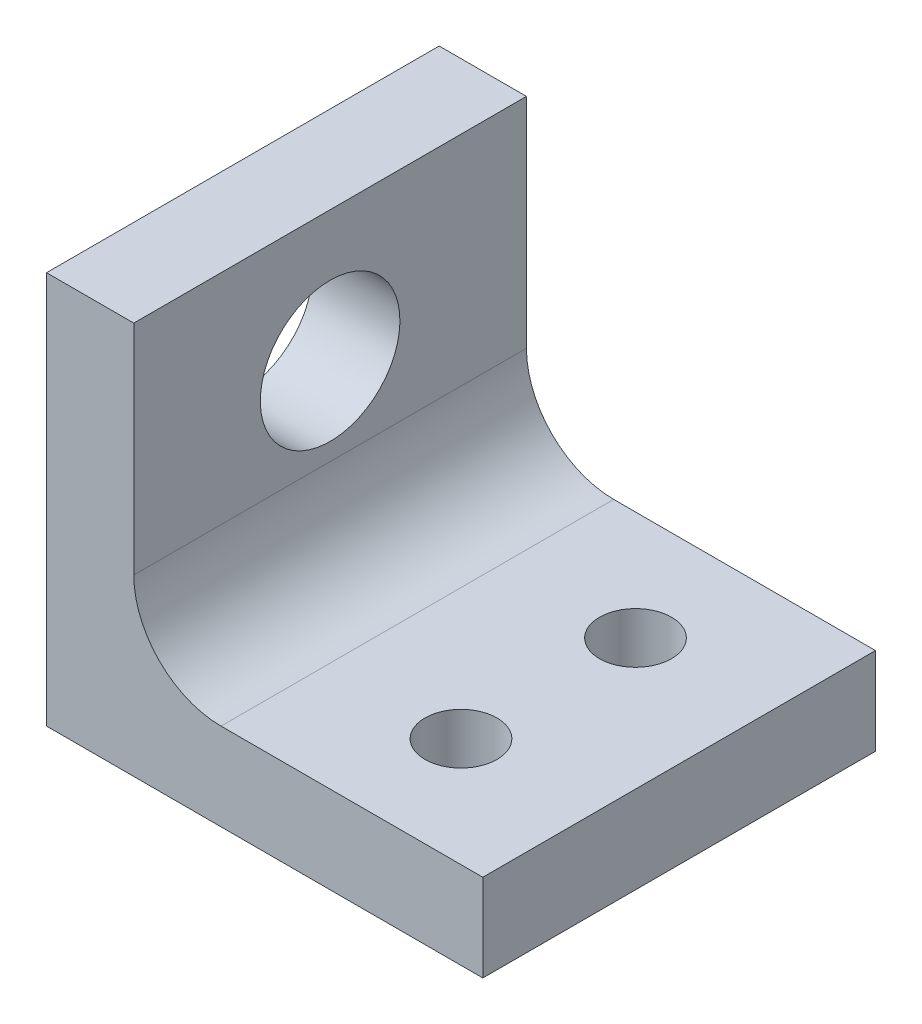
ISO-10303-21;
HEADER;
FILE_DESCRIPTION(('STEP AP214'),'2;1');
FILE_NAME('part.step','',(''),(''),'','','');
FILE_SCHEMA(('AUTOMOTIVE_DESIGN { 1 0 10303 214 1 1 1 1 }'));
ENDSEC;
DATA;
#1=APPLICATION_CONTEXT('core data for automotive mechanical design processes');
#2=APPLICATION_PROTOCOL_DEFINITION('international standard','automotive_design',2000,#1);
#3=PRODUCT_CONTEXT('',#1,'mechanical');
#4=PRODUCT('Part','Part','',(#3));
#5=PRODUCT_RELATED_PRODUCT_CATEGORY('part','',(#4));
#6=PRODUCT_DEFINITION_FORMATION('','',#4);
#7=PRODUCT_DEFINITION_CONTEXT('part definition',#1,'design');
#8=PRODUCT_DEFINITION('design','',#6,#7);
#9=PRODUCT_DEFINITION_SHAPE('','',#8);
#10=(LENGTH_UNIT() NAMED_UNIT(*) SI_UNIT(.MILLI.,.METRE.));
#11=(NAMED_UNIT(*) PLANE_ANGLE_UNIT() SI_UNIT($,.RADIAN.));
#12=(NAMED_UNIT(*) SI_UNIT($,.STERADIAN.) SOLID_ANGLE_UNIT());
#13=UNCERTAINTY_MEASURE_WITH_UNIT(LENGTH_MEASURE(1.E-05),#10,'distance_accuracy_value','');
#14=(GEOMETRIC_REPRESENTATION_CONTEXT(3) GLOBAL_UNCERTAINTY_ASSIGNED_CONTEXT((#13)) GLOBAL_UNIT_ASSIGNED_CONTEXT((#10,
#11,#12)) REPRESENTATION_CONTEXT('',''));
#15=CARTESIAN_POINT('',(0.,0.,0.));
#16=DIRECTION('',(0.,0.,1.));
#17=DIRECTION('',(1.,0.,0.));
#18=AXIS2_PLACEMENT_3D('',#15,#16,#17);
#19=CARTESIAN_POINT('',(20.,0.,18.));
#20=DIRECTION('',(0.,1.,0.));
#21=DIRECTION('',(-1.,0.,0.));
#22=AXIS2_PLACEMENT_3D('',#19,#20,#21);
#23=PLANE('',#22);
#24=CARTESIAN_POINT('',(14.,0.,5.));
#25=DIRECTION('',(0.,1.,0.));
#26=DIRECTION('',(-1.,0.,0.));
#27=AXIS2_PLACEMENT_3D('',#24,#25,#26);
#28=CIRCLE('',#27,1.65);
#29=CARTESIAN_POINT('',(12.35,0.,5.));
#30=VERTEX_POINT('',#29);
#31=EDGE_CURVE('E139',#30,#30,#28,.T.);
#32=ORIENTED_EDGE('',*,*,#31,.T.);
#33=EDGE_LOOP('',(#32));
#34=FACE_BOUND('',#33,.T.);
#35=CARTESIAN_POINT('',(14.,0.,13.));
#36=DIRECTION('',(0.,1.,0.));
#37=DIRECTION('',(-1.,0.,0.));
#38=AXIS2_PLACEMENT_3D('',#35,#36,#37);
#39=CIRCLE('',#38,1.65);
#40=CARTESIAN_POINT('',(12.35,0.,13.));
#41=VERTEX_POINT('',#40);
#42=EDGE_CURVE('E141',#41,#41,#39,.T.);
#43=ORIENTED_EDGE('',*,*,#42,.T.);
#44=EDGE_LOOP('',(#43));
#45=FACE_BOUND('',#44,.T.);
#46=DIRECTION('',(1.,0.,0.));
#47=VECTOR('',#46,1.);
#48=CARTESIAN_POINT('',(20.,0.,0.));
#49=LINE('',#48,#47);
#50=CARTESIAN_POINT('',(0.,0.,0.));
#51=VERTEX_POINT('',#50);
#52=CARTESIAN_POINT('',(20.,0.,0.));
#53=VERTEX_POINT('',#52);
#54=EDGE_CURVE('E119',#51,#53,#49,.T.);
#55=ORIENTED_EDGE('',*,*,#54,.T.);
#56=DIRECTION('',(0.,0.,-1.));
#57=VECTOR('',#56,1.);
#58=CARTESIAN_POINT('',(20.,0.,18.));
#59=LINE('',#58,#57);
#60=CARTESIAN_POINT('',(20.,0.,18.));
#61=VERTEX_POINT('',#60);
#62=EDGE_CURVE('E105',#61,#53,#59,.T.);
#63=ORIENTED_EDGE('',*,*,#62,.F.);
#64=DIRECTION('',(1.,0.,0.));
#65=VECTOR('',#64,1.);
#66=CARTESIAN_POINT('',(20.,0.,18.));
#67=LINE('',#66,#65);
#68=CARTESIAN_POINT('',(0.,0.,18.));
#69=VERTEX_POINT('',#68);
#70=EDGE_CURVE('E108',#69,#61,#67,.T.);
#71=ORIENTED_EDGE('',*,*,#70,.F.);
#72=DIRECTION('',(0.,0.,-1.));
#73=VECTOR('',#72,1.);
#74=CARTESIAN_POINT('',(0.,0.,18.));
#75=LINE('',#74,#73);
#76=EDGE_CURVE('E154',#69,#51,#75,.T.);
#77=ORIENTED_EDGE('',*,*,#76,.T.);
#78=EDGE_LOOP('',(#55,#63,#71,#77));
#79=FACE_BOUND('',#78,.T.);
#80=ADVANCED_FACE('F39',(#34,#45,#79),#23,.F.);
#81=CARTESIAN_POINT('',(20.,4.,18.));
#82=DIRECTION('',(-1.,0.,0.));
#83=DIRECTION('',(0.,0.,1.));
#84=AXIS2_PLACEMENT_3D('',#81,#82,#83);
#85=PLANE('',#84);
#86=DIRECTION('',(0.,1.,0.));
#87=VECTOR('',#86,1.);
#88=CARTESIAN_POINT('',(20.,4.,0.));
#89=LINE('',#88,#87);
#90=CARTESIAN_POINT('',(20.,4.,0.));
#91=VERTEX_POINT('',#90);
#92=EDGE_CURVE('E131',#53,#91,#89,.T.);
#93=ORIENTED_EDGE('',*,*,#92,.T.);
#94=DIRECTION('',(0.,0.,-1.));
#95=VECTOR('',#94,1.);
#96=CARTESIAN_POINT('',(20.,4.,18.));
#97=LINE('',#96,#95);
#98=CARTESIAN_POINT('',(20.,4.,18.));
#99=VERTEX_POINT('',#98);
#100=EDGE_CURVE('E102',#99,#91,#97,.T.);
#101=ORIENTED_EDGE('',*,*,#100,.F.);
#102=DIRECTION('',(0.,1.,0.));
#103=VECTOR('',#102,1.);
#104=CARTESIAN_POINT('',(20.,4.,18.));
#105=LINE('',#104,#103);
#106=EDGE_CURVE('E96',#61,#99,#105,.T.);
#107=ORIENTED_EDGE('',*,*,#106,.F.);
#108=ORIENTED_EDGE('',*,*,#62,.T.);
#109=EDGE_LOOP('',(#93,#101,#107,#108));
#110=FACE_BOUND('',#109,.T.);
#111=ADVANCED_FACE('F99',(#110),#85,.F.);
#112=CARTESIAN_POINT('',(4.,4.,18.));
#113=DIRECTION('',(0.,-1.,0.));
#114=DIRECTION('',(1.,0.,0.));
#115=AXIS2_PLACEMENT_3D('',#112,#113,#114);
#116=PLANE('',#115);
#117=CARTESIAN_POINT('',(14.,4.,5.));
#118=DIRECTION('',(0.,1.,0.));
#119=DIRECTION('',(-1.,0.,0.));
#120=AXIS2_PLACEMENT_3D('',#117,#118,#119);
#121=CIRCLE('',#120,1.65);
#122=CARTESIAN_POINT('',(12.35,4.,5.));
#123=VERTEX_POINT('',#122);
#124=EDGE_CURVE('E229',#123,#123,#121,.T.);
#125=ORIENTED_EDGE('',*,*,#124,.F.);
#126=EDGE_LOOP('',(#125));
#127=FACE_BOUND('',#126,.T.);
#128=CARTESIAN_POINT('',(14.,4.,13.));
#129=DIRECTION('',(0.,1.,0.));
#130=DIRECTION('',(-1.,0.,0.));
#131=AXIS2_PLACEMENT_3D('',#128,#129,#130);
#132=CIRCLE('',#131,1.65);
#133=CARTESIAN_POINT('',(12.35,4.,13.));
#134=VERTEX_POINT('',#133);
#135=EDGE_CURVE('E235',#134,#134,#132,.T.);
#136=ORIENTED_EDGE('',*,*,#135,.F.);
#137=EDGE_LOOP('',(#136));
#138=FACE_BOUND('',#137,.T.);
#139=DIRECTION('',(-1.,0.,0.));
#140=VECTOR('',#139,1.);
#141=CARTESIAN_POINT('',(4.,4.,0.));
#142=LINE('',#141,#140);
#143=CARTESIAN_POINT('',(8.,4.,0.));
#144=VERTEX_POINT('',#143);
#145=EDGE_CURVE('E151',#91,#144,#142,.T.);
#146=ORIENTED_EDGE('',*,*,#145,.T.);
#147=DIRECTION('',(0.,0.,-1.));
#148=VECTOR('',#147,1.);
#149=CARTESIAN_POINT('',(8.,4.,18.));
#150=LINE('',#149,#148);
#151=CARTESIAN_POINT('',(8.,4.,18.));
#152=VERTEX_POINT('',#151);
#153=EDGE_CURVE('E53',#144,#152,#150,.F.);
#154=ORIENTED_EDGE('',*,*,#153,.T.);
#155=DIRECTION('',(-1.,0.,0.));
#156=VECTOR('',#155,1.);
#157=CARTESIAN_POINT('',(4.,4.,18.));
#158=LINE('',#157,#156);
#159=EDGE_CURVE('E110',#99,#152,#158,.T.);
#160=ORIENTED_EDGE('',*,*,#159,.F.);
#161=ORIENTED_EDGE('',*,*,#100,.T.);
#162=EDGE_LOOP('',(#146,#154,#160,#161));
#163=FACE_BOUND('',#162,.T.);
#164=ADVANCED_FACE('F198',(#127,#138,#163),#116,.F.);
#165=CARTESIAN_POINT('',(4.,18.,18.));
#166=DIRECTION('',(-1.,0.,0.));
#167=DIRECTION('',(0.,-1.,0.));
#168=AXIS2_PLACEMENT_3D('',#165,#166,#167);
#169=PLANE('',#168);
#170=CARTESIAN_POINT('',(4.,12.,9.));
#171=DIRECTION('',(1.,0.,0.));
#172=DIRECTION('',(0.,1.,0.));
#173=AXIS2_PLACEMENT_3D('',#170,#171,#172);
#174=CIRCLE('',#173,3.2);
#175=CARTESIAN_POINT('',(4.,15.2,9.));
#176=VERTEX_POINT('',#175);
#177=EDGE_CURVE('E133',#176,#176,#174,.T.);
#178=ORIENTED_EDGE('',*,*,#177,.F.);
#179=EDGE_LOOP('',(#178));
#180=FACE_BOUND('',#179,.T.);
#181=DIRECTION('',(0.,1.,0.));
#182=VECTOR('',#181,1.);
#183=CARTESIAN_POINT('',(4.,18.,18.));
#184=LINE('',#183,#182);
#185=CARTESIAN_POINT('',(4.,8.,18.));
#186=VERTEX_POINT('',#185);
#187=CARTESIAN_POINT('',(4.,18.,18.));
#188=VERTEX_POINT('',#187);
#189=EDGE_CURVE('E149',#186,#188,#184,.T.);
#190=ORIENTED_EDGE('',*,*,#189,.F.);
#191=DIRECTION('',(0.,0.,-1.));
#192=VECTOR('',#191,1.);
#193=CARTESIAN_POINT('',(4.,8.,0.));
#194=LINE('',#193,#192);
#195=CARTESIAN_POINT('',(4.,8.,0.));
#196=VERTEX_POINT('',#195);
#197=EDGE_CURVE('E122',#186,#196,#194,.T.);
#198=ORIENTED_EDGE('',*,*,#197,.T.);
#199=DIRECTION('',(0.,1.,0.));
#200=VECTOR('',#199,1.);
#201=CARTESIAN_POINT('',(4.,18.,0.));
#202=LINE('',#201,#200);
#203=CARTESIAN_POINT('',(4.,18.,0.));
#204=VERTEX_POINT('',#203);
#205=EDGE_CURVE('E160',#196,#204,#202,.T.);
#206=ORIENTED_EDGE('',*,*,#205,.T.);
#207=DIRECTION('',(0.,0.,-1.));
#208=VECTOR('',#207,1.);
#209=CARTESIAN_POINT('',(4.,18.,18.));
#210=LINE('',#209,#208);
#211=EDGE_CURVE('E123',#188,#204,#210,.T.);
#212=ORIENTED_EDGE('',*,*,#211,.F.);
#213=EDGE_LOOP('',(#190,#198,#206,#212));
#214=FACE_BOUND('',#213,.T.);
#215=ADVANCED_FACE('F187',(#180,#214),#169,.F.);
#216=CARTESIAN_POINT('',(0.,18.,18.));
#217=DIRECTION('',(0.,-1.,0.));
#218=DIRECTION('',(0.,0.,-1.));
#219=AXIS2_PLACEMENT_3D('',#216,#217,#218);
#220=PLANE('',#219);
#221=DIRECTION('',(-1.,0.,0.));
#222=VECTOR('',#221,1.);
#223=CARTESIAN_POINT('',(0.,18.,0.));
#224=LINE('',#223,#222);
#225=CARTESIAN_POINT('',(0.,18.,0.));
#226=VERTEX_POINT('',#225);
#227=EDGE_CURVE('E156',#204,#226,#224,.T.);
#228=ORIENTED_EDGE('',*,*,#227,.T.);
#229=DIRECTION('',(0.,0.,-1.));
#230=VECTOR('',#229,1.);
#231=CARTESIAN_POINT('',(0.,18.,18.));
#232=LINE('',#231,#230);
#233=CARTESIAN_POINT('',(0.,18.,18.));
#234=VERTEX_POINT('',#233);
#235=EDGE_CURVE('E161',#234,#226,#232,.T.);
#236=ORIENTED_EDGE('',*,*,#235,.F.);
#237=DIRECTION('',(-1.,0.,0.));
#238=VECTOR('',#237,1.);
#239=CARTESIAN_POINT('',(0.,18.,18.));
#240=LINE('',#239,#238);
#241=EDGE_CURVE('E148',#188,#234,#240,.T.);
#242=ORIENTED_EDGE('',*,*,#241,.F.);
#243=ORIENTED_EDGE('',*,*,#211,.T.);
#244=EDGE_LOOP('',(#228,#236,#242,#243));
#245=FACE_BOUND('',#244,.T.);
#246=ADVANCED_FACE('F167',(#245),#220,.F.);
#247=CARTESIAN_POINT('',(0.,0.,18.));
#248=DIRECTION('',(1.,0.,0.));
#249=DIRECTION('',(0.,0.,-1.));
#250=AXIS2_PLACEMENT_3D('',#247,#248,#249);
#251=PLANE('',#250);
#252=CARTESIAN_POINT('',(0.,12.,9.));
#253=DIRECTION('',(1.,0.,0.));
#254=DIRECTION('',(0.,0.,-1.));
#255=AXIS2_PLACEMENT_3D('',#252,#253,#254);
#256=CIRCLE('',#255,3.2);
#257=CARTESIAN_POINT('',(0.,12.,5.8));
#258=VERTEX_POINT('',#257);
#259=EDGE_CURVE('E126',#258,#258,#256,.T.);
#260=ORIENTED_EDGE('',*,*,#259,.T.);
#261=EDGE_LOOP('',(#260));
#262=FACE_BOUND('',#261,.T.);
#263=DIRECTION('',(0.,-1.,0.));
#264=VECTOR('',#263,1.);
#265=CARTESIAN_POINT('',(0.,0.,0.));
#266=LINE('',#265,#264);
#267=EDGE_CURVE('E120',#226,#51,#266,.T.);
#268=ORIENTED_EDGE('',*,*,#267,.T.);
#269=ORIENTED_EDGE('',*,*,#76,.F.);
#270=DIRECTION('',(0.,-1.,0.));
#271=VECTOR('',#270,1.);
#272=CARTESIAN_POINT('',(0.,0.,18.));
#273=LINE('',#272,#271);
#274=EDGE_CURVE('E113',#234,#69,#273,.T.);
#275=ORIENTED_EDGE('',*,*,#274,.F.);
#276=ORIENTED_EDGE('',*,*,#235,.T.);
#277=EDGE_LOOP('',(#268,#269,#275,#276));
#278=FACE_BOUND('',#277,.T.);
#279=ADVANCED_FACE('F180',(#262,#278),#251,.F.);
#280=CARTESIAN_POINT('',(0.,0.,18.));
#281=DIRECTION('',(0.,0.,-1.));
#282=DIRECTION('',(-1.,0.,0.));
#283=AXIS2_PLACEMENT_3D('',#280,#281,#282);
#284=PLANE('',#283);
#285=ORIENTED_EDGE('',*,*,#70,.T.);
#286=ORIENTED_EDGE('',*,*,#106,.T.);
#287=ORIENTED_EDGE('',*,*,#159,.T.);
#288=CARTESIAN_POINT('',(8.,8.,18.));
#289=DIRECTION('',(0.,0.,-1.));
#290=DIRECTION('',(-1.,0.,0.));
#291=AXIS2_PLACEMENT_3D('',#288,#289,#290);
#292=CIRCLE('',#291,4.);
#293=EDGE_CURVE('E11',#152,#186,#292,.T.);
#294=ORIENTED_EDGE('',*,*,#293,.T.);
#295=ORIENTED_EDGE('',*,*,#189,.T.);
#296=ORIENTED_EDGE('',*,*,#241,.T.);
#297=ORIENTED_EDGE('',*,*,#274,.T.);
#298=EDGE_LOOP('',(#285,#286,#287,#294,#295,#296,#297));
#299=FACE_BOUND('',#298,.T.);
#300=ADVANCED_FACE('F111',(#299),#284,.F.);
#301=CARTESIAN_POINT('',(0.,0.,0.));
#302=DIRECTION('',(0.,0.,-1.));
#303=DIRECTION('',(-1.,0.,0.));
#304=AXIS2_PLACEMENT_3D('',#301,#302,#303);
#305=PLANE('',#304);
#306=ORIENTED_EDGE('',*,*,#54,.F.);
#307=ORIENTED_EDGE('',*,*,#267,.F.);
#308=ORIENTED_EDGE('',*,*,#227,.F.);
#309=ORIENTED_EDGE('',*,*,#205,.F.);
#310=CARTESIAN_POINT('',(8.,8.,0.));
#311=DIRECTION('',(0.,0.,-1.));
#312=DIRECTION('',(-1.,0.,0.));
#313=AXIS2_PLACEMENT_3D('',#310,#311,#312);
#314=CIRCLE('',#313,4.);
#315=EDGE_CURVE('E50',#196,#144,#314,.F.);
#316=ORIENTED_EDGE('',*,*,#315,.T.);
#317=ORIENTED_EDGE('',*,*,#145,.F.);
#318=ORIENTED_EDGE('',*,*,#92,.F.);
#319=EDGE_LOOP('',(#306,#307,#308,#309,#316,#317,#318));
#320=FACE_BOUND('',#319,.T.);
#321=ADVANCED_FACE('F174',(#320),#305,.T.);
#322=CARTESIAN_POINT('',(-21.,12.,9.));
#323=DIRECTION('',(1.,0.,0.));
#324=DIRECTION('',(0.,1.,0.));
#325=AXIS2_PLACEMENT_3D('',#322,#323,#324);
#326=CYLINDRICAL_SURFACE('',#325,3.2);
#327=ORIENTED_EDGE('',*,*,#177,.T.);
#328=EDGE_LOOP('',(#327));
#329=FACE_BOUND('',#328,.T.);
#330=ORIENTED_EDGE('',*,*,#259,.F.);
#331=EDGE_LOOP('',(#330));
#332=FACE_BOUND('',#331,.T.);
#333=ADVANCED_FACE('F208',(#329,#332),#326,.F.);
#334=CARTESIAN_POINT('',(8.,8.,18.));
#335=DIRECTION('',(0.,0.,1.));
#336=DIRECTION('',(1.,0.,0.));
#337=AXIS2_PLACEMENT_3D('',#334,#335,#336);
#338=CYLINDRICAL_SURFACE('',#337,4.);
#339=ORIENTED_EDGE('',*,*,#293,.F.);
#340=ORIENTED_EDGE('',*,*,#153,.F.);
#341=ORIENTED_EDGE('',*,*,#315,.F.);
#342=ORIENTED_EDGE('',*,*,#197,.F.);
#343=EDGE_LOOP('',(#339,#340,#341,#342));
#344=FACE_BOUND('',#343,.T.);
#345=ADVANCED_FACE('F41',(#344),#338,.F.);
#346=CARTESIAN_POINT('',(14.,-21.,13.));
#347=DIRECTION('',(0.,1.,0.));
#348=DIRECTION('',(-1.,0.,0.));
#349=AXIS2_PLACEMENT_3D('',#346,#347,#348);
#350=CYLINDRICAL_SURFACE('',#349,1.65);
#351=ORIENTED_EDGE('',*,*,#135,.T.);
#352=EDGE_LOOP('',(#351));
#353=FACE_BOUND('',#352,.T.);
#354=ORIENTED_EDGE('',*,*,#42,.F.);
#355=EDGE_LOOP('',(#354));
#356=FACE_BOUND('',#355,.T.);
#357=ADVANCED_FACE('F209',(#353,#356),#350,.F.);
#358=CARTESIAN_POINT('',(14.,-21.,5.));
#359=DIRECTION('',(0.,1.,0.));
#360=DIRECTION('',(-1.,0.,0.));
#361=AXIS2_PLACEMENT_3D('',#358,#359,#360);
#362=CYLINDRICAL_SURFACE('',#361,1.65);
#363=ORIENTED_EDGE('',*,*,#124,.T.);
#364=EDGE_LOOP('',(#363));
#365=FACE_BOUND('',#364,.T.);
#366=ORIENTED_EDGE('',*,*,#31,.F.);
#367=EDGE_LOOP('',(#366));
#368=FACE_BOUND('',#367,.T.);
#369=ADVANCED_FACE('F213',(#365,#368),#362,.F.);
#370=CLOSED_SHELL('',(#80,#111,#164,#215,#246,#279,#300,#321,#333,#345,#357,#369));
#371=MANIFOLD_SOLID_BREP('B2',#370);
#372=ADVANCED_BREP_SHAPE_REPRESENTATION('',(#18,#371),#14);
#373=SHAPE_DEFINITION_REPRESENTATION(#9,#372);
ENDSEC;
END-ISO-10303-21;
